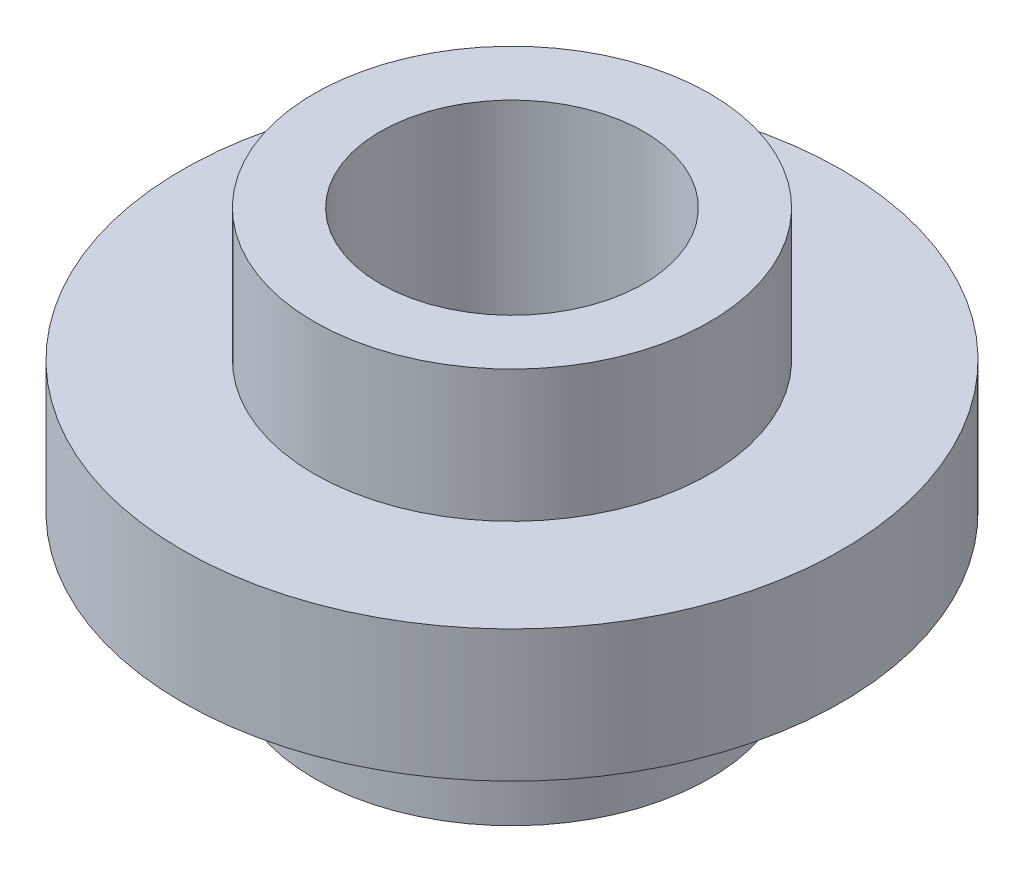
ISO-10303-21;
HEADER;
FILE_DESCRIPTION(('STEP AP214'),'2;1');
FILE_NAME('part.step','',(''),(''),'','','');
FILE_SCHEMA(('AUTOMOTIVE_DESIGN { 1 0 10303 214 1 1 1 1 }'));
ENDSEC;
DATA;
#1=APPLICATION_CONTEXT('core data for automotive mechanical design processes');
#2=APPLICATION_PROTOCOL_DEFINITION('international standard','automotive_design',2000,#1);
#3=PRODUCT_CONTEXT('',#1,'mechanical');
#4=PRODUCT('Part','Part','',(#3));
#5=PRODUCT_RELATED_PRODUCT_CATEGORY('part','',(#4));
#6=PRODUCT_DEFINITION_FORMATION('','',#4);
#7=PRODUCT_DEFINITION_CONTEXT('part definition',#1,'design');
#8=PRODUCT_DEFINITION('design','',#6,#7);
#9=PRODUCT_DEFINITION_SHAPE('','',#8);
#10=(LENGTH_UNIT() NAMED_UNIT(*) SI_UNIT(.MILLI.,.METRE.));
#11=(NAMED_UNIT(*) PLANE_ANGLE_UNIT() SI_UNIT($,.RADIAN.));
#12=(NAMED_UNIT(*) SI_UNIT($,.STERADIAN.) SOLID_ANGLE_UNIT());
#13=UNCERTAINTY_MEASURE_WITH_UNIT(LENGTH_MEASURE(1.E-05),#10,'distance_accuracy_value','');
#14=(GEOMETRIC_REPRESENTATION_CONTEXT(3) GLOBAL_UNCERTAINTY_ASSIGNED_CONTEXT((#13)) GLOBAL_UNIT_ASSIGNED_CONTEXT((#10,
#11,#12)) REPRESENTATION_CONTEXT('',''));
#15=CARTESIAN_POINT('',(0.,0.,0.));
#16=DIRECTION('',(0.,0.,1.));
#17=DIRECTION('',(1.,0.,0.));
#18=AXIS2_PLACEMENT_3D('',#15,#16,#17);
#19=CARTESIAN_POINT('',(0.,3.175,0.));
#20=DIRECTION('',(0.,1.,0.));
#21=DIRECTION('',(0.,0.,1.));
#22=AXIS2_PLACEMENT_3D('',#19,#20,#21);
#23=PLANE('',#22);
#24=CARTESIAN_POINT('',(0.,3.175,0.));
#25=DIRECTION('',(0.,1.,0.));
#26=DIRECTION('',(0.,0.,1.));
#27=AXIS2_PLACEMENT_3D('',#24,#25,#26);
#28=CIRCLE('',#27,4.7625);
#29=CARTESIAN_POINT('',(0.,3.175,4.7625));
#30=VERTEX_POINT('',#29);
#31=EDGE_CURVE('E10',#30,#30,#28,.T.);
#32=ORIENTED_EDGE('',*,*,#31,.F.);
#33=EDGE_LOOP('',(#32));
#34=FACE_BOUND('',#33,.T.);
#35=CARTESIAN_POINT('',(0.,3.175,0.));
#36=DIRECTION('',(0.,1.,0.));
#37=DIRECTION('',(0.,0.,1.));
#38=AXIS2_PLACEMENT_3D('',#35,#36,#37);
#39=CIRCLE('',#38,7.9375);
#40=CARTESIAN_POINT('',(0.,3.175,7.9375));
#41=VERTEX_POINT('',#40);
#42=EDGE_CURVE('E39',#41,#41,#39,.T.);
#43=ORIENTED_EDGE('',*,*,#42,.T.);
#44=EDGE_LOOP('',(#43));
#45=FACE_BOUND('',#44,.T.);
#46=ADVANCED_FACE('F31',(#34,#45),#23,.T.);
#47=CARTESIAN_POINT('',(0.,0.,0.));
#48=DIRECTION('',(0.,1.,0.));
#49=DIRECTION('',(0.,0.,1.));
#50=AXIS2_PLACEMENT_3D('',#47,#48,#49);
#51=PLANE('',#50);
#52=CARTESIAN_POINT('',(0.,0.,0.));
#53=DIRECTION('',(0.,1.,0.));
#54=DIRECTION('',(0.,0.,1.));
#55=AXIS2_PLACEMENT_3D('',#52,#53,#54);
#56=CIRCLE('',#55,4.7625);
#57=CARTESIAN_POINT('',(0.,0.,4.7625));
#58=VERTEX_POINT('',#57);
#59=EDGE_CURVE('E35',#58,#58,#56,.T.);
#60=ORIENTED_EDGE('',*,*,#59,.T.);
#61=EDGE_LOOP('',(#60));
#62=FACE_BOUND('',#61,.T.);
#63=CARTESIAN_POINT('',(0.,0.,0.));
#64=DIRECTION('',(0.,1.,0.));
#65=DIRECTION('',(0.,0.,1.));
#66=AXIS2_PLACEMENT_3D('',#63,#64,#65);
#67=CIRCLE('',#66,7.9375);
#68=CARTESIAN_POINT('',(0.,0.,7.9375));
#69=VERTEX_POINT('',#68);
#70=EDGE_CURVE('E44',#69,#69,#67,.T.);
#71=ORIENTED_EDGE('',*,*,#70,.F.);
#72=EDGE_LOOP('',(#71));
#73=FACE_BOUND('',#72,.T.);
#74=ADVANCED_FACE('F84',(#62,#73),#51,.F.);
#75=CARTESIAN_POINT('',(0.,3.175,0.));
#76=DIRECTION('',(0.,-1.,0.));
#77=DIRECTION('',(0.,0.,-1.));
#78=AXIS2_PLACEMENT_3D('',#75,#76,#77);
#79=CYLINDRICAL_SURFACE('',#78,7.9375);
#80=ORIENTED_EDGE('',*,*,#42,.F.);
#81=EDGE_LOOP('',(#80));
#82=FACE_BOUND('',#81,.T.);
#83=ORIENTED_EDGE('',*,*,#70,.T.);
#84=EDGE_LOOP('',(#83));
#85=FACE_BOUND('',#84,.T.);
#86=ADVANCED_FACE('F33',(#82,#85),#79,.T.);
#87=CARTESIAN_POINT('',(0.,-3.175,0.));
#88=DIRECTION('',(0.,1.,0.));
#89=DIRECTION('',(0.,0.,1.));
#90=AXIS2_PLACEMENT_3D('',#87,#88,#89);
#91=CYLINDRICAL_SURFACE('',#90,4.7625);
#92=CARTESIAN_POINT('',(0.,-3.175,0.));
#93=DIRECTION('',(0.,1.,0.));
#94=DIRECTION('',(0.,0.,1.));
#95=AXIS2_PLACEMENT_3D('',#92,#93,#94);
#96=CIRCLE('',#95,4.7625);
#97=CARTESIAN_POINT('',(0.,-3.175,4.7625));
#98=VERTEX_POINT('',#97);
#99=EDGE_CURVE('E47',#98,#98,#96,.T.);
#100=ORIENTED_EDGE('',*,*,#99,.T.);
#101=EDGE_LOOP('',(#100));
#102=FACE_BOUND('',#101,.T.);
#103=ORIENTED_EDGE('',*,*,#59,.F.);
#104=EDGE_LOOP('',(#103));
#105=FACE_BOUND('',#104,.T.);
#106=ADVANCED_FACE('F81',(#102,#105),#91,.T.);
#107=CARTESIAN_POINT('',(0.,-3.175,0.));
#108=DIRECTION('',(0.,1.,0.));
#109=DIRECTION('',(0.,0.,1.));
#110=AXIS2_PLACEMENT_3D('',#107,#108,#109);
#111=PLANE('',#110);
#112=CARTESIAN_POINT('',(0.,-3.175,0.));
#113=DIRECTION('',(0.,1.,0.));
#114=DIRECTION('',(0.,0.,1.));
#115=AXIS2_PLACEMENT_3D('',#112,#113,#114);
#116=CIRCLE('',#115,3.175);
#117=CARTESIAN_POINT('',(0.,-3.175,3.175));
#118=VERTEX_POINT('',#117);
#119=EDGE_CURVE('E56',#118,#118,#116,.T.);
#120=ORIENTED_EDGE('',*,*,#119,.T.);
#121=EDGE_LOOP('',(#120));
#122=FACE_BOUND('',#121,.T.);
#123=ORIENTED_EDGE('',*,*,#99,.F.);
#124=EDGE_LOOP('',(#123));
#125=FACE_BOUND('',#124,.T.);
#126=ADVANCED_FACE('F93',(#122,#125),#111,.F.);
#127=CARTESIAN_POINT('',(0.,3.175,0.));
#128=DIRECTION('',(0.,-1.,0.));
#129=DIRECTION('',(0.,0.,-1.));
#130=AXIS2_PLACEMENT_3D('',#127,#128,#129);
#131=CYLINDRICAL_SURFACE('',#130,3.175);
#132=ORIENTED_EDGE('',*,*,#119,.F.);
#133=EDGE_LOOP('',(#132));
#134=FACE_BOUND('',#133,.T.);
#135=CARTESIAN_POINT('',(0.,6.35,0.));
#136=DIRECTION('',(0.,1.,0.));
#137=DIRECTION('',(0.,0.,1.));
#138=AXIS2_PLACEMENT_3D('',#135,#136,#137);
#139=CIRCLE('',#138,3.175);
#140=CARTESIAN_POINT('',(0.,6.35,3.175));
#141=VERTEX_POINT('',#140);
#142=EDGE_CURVE('E64',#141,#141,#139,.T.);
#143=ORIENTED_EDGE('',*,*,#142,.T.);
#144=EDGE_LOOP('',(#143));
#145=FACE_BOUND('',#144,.T.);
#146=ADVANCED_FACE('F70',(#134,#145),#131,.F.);
#147=ORIENTED_EDGE('',*,*,#31,.T.);
#148=EDGE_LOOP('',(#147));
#149=FACE_BOUND('',#148,.T.);
#150=CARTESIAN_POINT('',(0.,6.35,0.));
#151=DIRECTION('',(0.,1.,0.));
#152=DIRECTION('',(0.,0.,1.));
#153=AXIS2_PLACEMENT_3D('',#150,#151,#152);
#154=CIRCLE('',#153,4.7625);
#155=CARTESIAN_POINT('',(0.,6.35,4.7625));
#156=VERTEX_POINT('',#155);
#157=EDGE_CURVE('E60',#156,#156,#154,.T.);
#158=ORIENTED_EDGE('',*,*,#157,.F.);
#159=EDGE_LOOP('',(#158));
#160=FACE_BOUND('',#159,.T.);
#161=ADVANCED_FACE('F74',(#149,#160),#91,.T.);
#162=CARTESIAN_POINT('',(0.,6.35,0.));
#163=DIRECTION('',(0.,1.,0.));
#164=DIRECTION('',(0.,0.,1.));
#165=AXIS2_PLACEMENT_3D('',#162,#163,#164);
#166=PLANE('',#165);
#167=ORIENTED_EDGE('',*,*,#157,.T.);
#168=EDGE_LOOP('',(#167));
#169=FACE_BOUND('',#168,.T.);
#170=ORIENTED_EDGE('',*,*,#142,.F.);
#171=EDGE_LOOP('',(#170));
#172=FACE_BOUND('',#171,.T.);
#173=ADVANCED_FACE('F72',(#169,#172),#166,.T.);
#174=CLOSED_SHELL('',(#46,#74,#86,#106,#126,#146,#161,#173));
#175=MANIFOLD_SOLID_BREP('B2',#174);
#176=ADVANCED_BREP_SHAPE_REPRESENTATION('',(#18,#175),#14);
#177=SHAPE_DEFINITION_REPRESENTATION(#9,#176);
ENDSEC;
END-ISO-10303-21;
